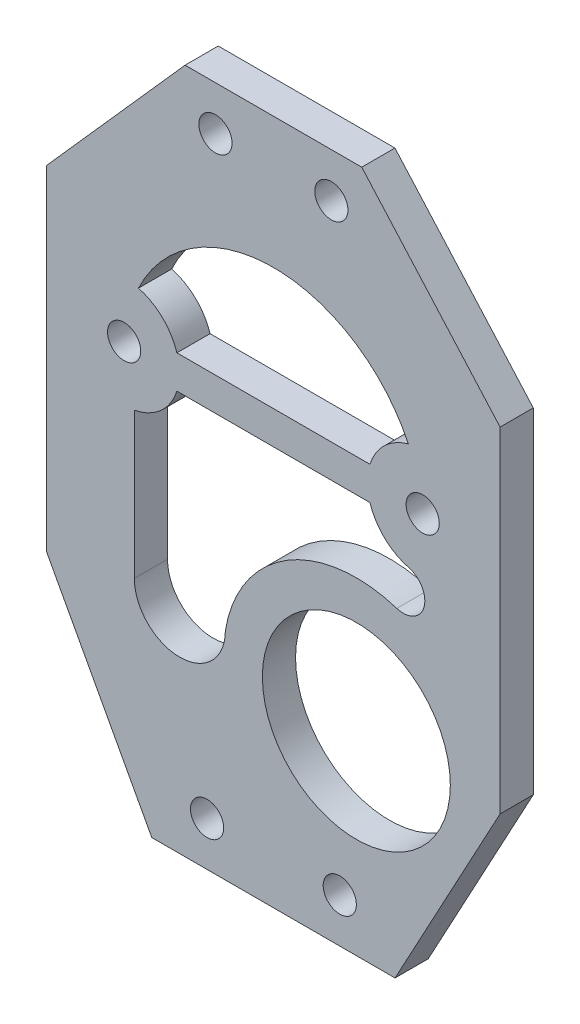
ISO-10303-21;
HEADER;
FILE_DESCRIPTION(('STEP AP214'),'2;1');
FILE_NAME('part.step','',(''),(''),'','','');
FILE_SCHEMA(('AUTOMOTIVE_DESIGN { 1 0 10303 214 1 1 1 1 }'));
ENDSEC;
DATA;
#1=APPLICATION_CONTEXT('core data for automotive mechanical design processes');
#2=APPLICATION_PROTOCOL_DEFINITION('international standard','automotive_design',2000,#1);
#3=PRODUCT_CONTEXT('',#1,'mechanical');
#4=PRODUCT('Part','Part','',(#3));
#5=PRODUCT_RELATED_PRODUCT_CATEGORY('part','',(#4));
#6=PRODUCT_DEFINITION_FORMATION('','',#4);
#7=PRODUCT_DEFINITION_CONTEXT('part definition',#1,'design');
#8=PRODUCT_DEFINITION('design','',#6,#7);
#9=PRODUCT_DEFINITION_SHAPE('','',#8);
#10=(LENGTH_UNIT() NAMED_UNIT(*) SI_UNIT(.MILLI.,.METRE.));
#11=(NAMED_UNIT(*) PLANE_ANGLE_UNIT() SI_UNIT($,.RADIAN.));
#12=(NAMED_UNIT(*) SI_UNIT($,.STERADIAN.) SOLID_ANGLE_UNIT());
#13=UNCERTAINTY_MEASURE_WITH_UNIT(LENGTH_MEASURE(1.E-05),#10,'distance_accuracy_value','');
#14=(GEOMETRIC_REPRESENTATION_CONTEXT(3) GLOBAL_UNCERTAINTY_ASSIGNED_CONTEXT((#13)) GLOBAL_UNIT_ASSIGNED_CONTEXT((#10,
#11,#12)) REPRESENTATION_CONTEXT('',''));
#15=CARTESIAN_POINT('',(0.,0.,0.));
#16=DIRECTION('',(0.,0.,1.));
#17=DIRECTION('',(1.,0.,0.));
#18=AXIS2_PLACEMENT_3D('',#15,#16,#17);
#19=CARTESIAN_POINT('',(11.7491477566959,30.8805656627284,3.));
#20=DIRECTION('',(0.,0.,-1.));
#21=DIRECTION('',(-1.,0.,0.));
#22=AXIS2_PLACEMENT_3D('',#19,#20,#21);
#23=CYLINDRICAL_SURFACE('',#22,1.94403911705029);
#24=CARTESIAN_POINT('',(11.7491477566959,30.8805656627284,0.));
#25=DIRECTION('',(0.,0.,1.));
#26=DIRECTION('',(1.,0.,0.));
#27=AXIS2_PLACEMENT_3D('',#24,#25,#26);
#28=CIRCLE('',#27,1.94403911705029);
#29=CARTESIAN_POINT('',(11.1567434050011,29.0289865602554,0.));
#30=VERTEX_POINT('',#29);
#31=CARTESIAN_POINT('',(12.2023496651043,32.7710407667265,0.));
#32=VERTEX_POINT('',#31);
#33=EDGE_CURVE('E264',#30,#32,#28,.T.);
#34=ORIENTED_EDGE('',*,*,#33,.F.);
#35=DIRECTION('',(0.,0.,-1.));
#36=VECTOR('',#35,1.);
#37=CARTESIAN_POINT('',(11.1567434050011,29.0289865602554,3.));
#38=LINE('',#37,#36);
#39=CARTESIAN_POINT('',(11.1567434050011,29.0289865602554,3.));
#40=VERTEX_POINT('',#39);
#41=EDGE_CURVE('E11',#40,#30,#38,.T.);
#42=ORIENTED_EDGE('',*,*,#41,.F.);
#43=CARTESIAN_POINT('',(11.7491477566959,30.8805656627284,3.));
#44=DIRECTION('',(0.,0.,1.));
#45=DIRECTION('',(1.,0.,0.));
#46=AXIS2_PLACEMENT_3D('',#43,#44,#45);
#47=CIRCLE('',#46,1.94403911705029);
#48=CARTESIAN_POINT('',(12.2023496651043,32.7710407667265,3.));
#49=VERTEX_POINT('',#48);
#50=EDGE_CURVE('E376',#40,#49,#47,.T.);
#51=ORIENTED_EDGE('',*,*,#50,.T.);
#52=DIRECTION('',(0.,0.,-1.));
#53=VECTOR('',#52,1.);
#54=CARTESIAN_POINT('',(12.2023496651043,32.7710407667265,3.));
#55=LINE('',#54,#53);
#56=EDGE_CURVE('E125',#49,#32,#55,.T.);
#57=ORIENTED_EDGE('',*,*,#56,.T.);
#58=EDGE_LOOP('',(#34,#42,#51,#57));
#59=FACE_BOUND('',#58,.T.);
#60=ADVANCED_FACE('F39',(#59),#23,.F.);
#61=CARTESIAN_POINT('',(7.50000000000001,17.599715906798,3.));
#62=DIRECTION('',(0.,0.,-1.));
#63=DIRECTION('',(-1.,0.,0.));
#64=AXIS2_PLACEMENT_3D('',#61,#62,#63);
#65=CYLINDRICAL_SURFACE('',#64,12.);
#66=CARTESIAN_POINT('',(7.50000000000001,17.599715906798,0.));
#67=DIRECTION('',(0.,0.,1.));
#68=DIRECTION('',(1.,0.,0.));
#69=AXIS2_PLACEMENT_3D('',#66,#67,#68);
#70=CIRCLE('',#69,12.);
#71=CARTESIAN_POINT('',(-4.34776022034606,19.5051234120801,0.));
#72=VERTEX_POINT('',#71);
#73=EDGE_CURVE('E267',#30,#72,#70,.T.);
#74=ORIENTED_EDGE('',*,*,#73,.T.);
#75=DIRECTION('',(0.,0.,-1.));
#76=VECTOR('',#75,1.);
#77=CARTESIAN_POINT('',(-4.34776022034606,19.5051234120801,3.));
#78=LINE('',#77,#76);
#79=CARTESIAN_POINT('',(-4.34776022034606,19.5051234120801,3.));
#80=VERTEX_POINT('',#79);
#81=EDGE_CURVE('E49',#80,#72,#78,.T.);
#82=ORIENTED_EDGE('',*,*,#81,.F.);
#83=CARTESIAN_POINT('',(7.50000000000001,17.599715906798,3.));
#84=DIRECTION('',(0.,0.,1.));
#85=DIRECTION('',(1.,0.,0.));
#86=AXIS2_PLACEMENT_3D('',#83,#84,#85);
#87=CIRCLE('',#86,12.);
#88=EDGE_CURVE('E378',#40,#80,#87,.T.);
#89=ORIENTED_EDGE('',*,*,#88,.F.);
#90=ORIENTED_EDGE('',*,*,#41,.T.);
#91=EDGE_LOOP('',(#74,#82,#89,#90));
#92=FACE_BOUND('',#91,.T.);
#93=ADVANCED_FACE('F392',(#92),#65,.T.);
#94=CARTESIAN_POINT('',(-8.46321629107642,19.5051234120801,3.));
#95=DIRECTION('',(0.,0.,-1.));
#96=DIRECTION('',(-1.,0.,0.));
#97=AXIS2_PLACEMENT_3D('',#94,#95,#96);
#98=CYLINDRICAL_SURFACE('',#97,4.11545607073036);
#99=CARTESIAN_POINT('',(-8.46321629107642,19.5051234120801,0.));
#100=DIRECTION('',(0.,0.,1.));
#101=DIRECTION('',(1.,0.,0.));
#102=AXIS2_PLACEMENT_3D('',#99,#100,#101);
#103=CIRCLE('',#102,4.11545607073036);
#104=CARTESIAN_POINT('',(-12.5786723618068,19.5051234120801,0.));
#105=VERTEX_POINT('',#104);
#106=EDGE_CURVE('E270',#105,#72,#103,.T.);
#107=ORIENTED_EDGE('',*,*,#106,.F.);
#108=DIRECTION('',(0.,0.,-1.));
#109=VECTOR('',#108,1.);
#110=CARTESIAN_POINT('',(-12.5786723618068,19.5051234120801,3.));
#111=LINE('',#110,#109);
#112=CARTESIAN_POINT('',(-12.5786723618068,19.5051234120801,3.));
#113=VERTEX_POINT('',#112);
#114=EDGE_CURVE('E285',#113,#105,#111,.T.);
#115=ORIENTED_EDGE('',*,*,#114,.F.);
#116=CARTESIAN_POINT('',(-8.46321629107642,19.5051234120801,3.));
#117=DIRECTION('',(0.,0.,1.));
#118=DIRECTION('',(1.,0.,0.));
#119=AXIS2_PLACEMENT_3D('',#116,#117,#118);
#120=CIRCLE('',#119,4.11545607073036);
#121=EDGE_CURVE('E380',#113,#80,#120,.T.);
#122=ORIENTED_EDGE('',*,*,#121,.T.);
#123=ORIENTED_EDGE('',*,*,#81,.T.);
#124=EDGE_LOOP('',(#107,#115,#122,#123));
#125=FACE_BOUND('',#124,.T.);
#126=ADVANCED_FACE('F394',(#125),#98,.F.);
#127=CARTESIAN_POINT('',(-12.5786723618068,0.,3.));
#128=DIRECTION('',(1.,0.,0.));
#129=DIRECTION('',(0.,0.,-1.));
#130=AXIS2_PLACEMENT_3D('',#127,#128,#129);
#131=PLANE('',#130);
#132=DIRECTION('',(0.,-1.,0.));
#133=VECTOR('',#132,1.);
#134=CARTESIAN_POINT('',(-12.5786723618068,0.,0.));
#135=LINE('',#134,#133);
#136=CARTESIAN_POINT('',(-12.5786723618068,32.6853334040719,0.));
#137=VERTEX_POINT('',#136);
#138=EDGE_CURVE('E273',#137,#105,#135,.T.);
#139=ORIENTED_EDGE('',*,*,#138,.F.);
#140=DIRECTION('',(0.,0.,-1.));
#141=VECTOR('',#140,1.);
#142=CARTESIAN_POINT('',(-12.5786723618068,32.6853334040719,3.));
#143=LINE('',#142,#141);
#144=CARTESIAN_POINT('',(-12.5786723618068,32.6853334040719,3.));
#145=VERTEX_POINT('',#144);
#146=EDGE_CURVE('E193',#145,#137,#143,.T.);
#147=ORIENTED_EDGE('',*,*,#146,.F.);
#148=DIRECTION('',(0.,-1.,0.));
#149=VECTOR('',#148,1.);
#150=CARTESIAN_POINT('',(-12.5786723618068,0.,3.));
#151=LINE('',#150,#149);
#152=EDGE_CURVE('E200',#145,#113,#151,.T.);
#153=ORIENTED_EDGE('',*,*,#152,.T.);
#154=ORIENTED_EDGE('',*,*,#114,.T.);
#155=EDGE_LOOP('',(#139,#147,#153,#154));
#156=FACE_BOUND('',#155,.T.);
#157=ADVANCED_FACE('F384',(#156),#131,.T.);
#158=CARTESIAN_POINT('',(-13.5,37.599715906798,3.));
#159=DIRECTION('',(0.,0.,-1.));
#160=DIRECTION('',(-1.,0.,0.));
#161=AXIS2_PLACEMENT_3D('',#158,#159,#160);
#162=CYLINDRICAL_SURFACE('',#161,5.);
#163=CARTESIAN_POINT('',(-13.5,37.599715906798,0.));
#164=DIRECTION('',(0.,0.,1.));
#165=DIRECTION('',(1.,0.,0.));
#166=AXIS2_PLACEMENT_3D('',#163,#164,#165);
#167=CIRCLE('',#166,5.);
#168=CARTESIAN_POINT('',(-8.73030399291528,36.0997159067981,0.));
#169=VERTEX_POINT('',#168);
#170=EDGE_CURVE('E188',#169,#137,#167,.F.);
#171=ORIENTED_EDGE('',*,*,#170,.F.);
#172=DIRECTION('',(0.,0.,-1.));
#173=VECTOR('',#172,1.);
#174=CARTESIAN_POINT('',(-8.73030399291528,36.0997159067981,3.));
#175=LINE('',#174,#173);
#176=CARTESIAN_POINT('',(-8.73030399291528,36.0997159067981,3.));
#177=VERTEX_POINT('',#176);
#178=EDGE_CURVE('E183',#177,#169,#175,.T.);
#179=ORIENTED_EDGE('',*,*,#178,.F.);
#180=CARTESIAN_POINT('',(-13.5,37.599715906798,3.));
#181=DIRECTION('',(0.,0.,1.));
#182=DIRECTION('',(1.,0.,0.));
#183=AXIS2_PLACEMENT_3D('',#180,#181,#182);
#184=CIRCLE('',#183,5.);
#185=EDGE_CURVE('E186',#177,#145,#184,.F.);
#186=ORIENTED_EDGE('',*,*,#185,.T.);
#187=ORIENTED_EDGE('',*,*,#146,.T.);
#188=EDGE_LOOP('',(#171,#179,#186,#187));
#189=FACE_BOUND('',#188,.T.);
#190=ADVANCED_FACE('F185',(#189),#162,.T.);
#191=CARTESIAN_POINT('',(0.,36.099715906798,3.));
#192=DIRECTION('',(0.,-1.,0.));
#193=DIRECTION('',(1.,0.,0.));
#194=AXIS2_PLACEMENT_3D('',#191,#192,#193);
#195=PLANE('',#194);
#196=DIRECTION('',(-1.,0.,0.));
#197=VECTOR('',#196,1.);
#198=CARTESIAN_POINT('',(0.,36.099715906798,0.));
#199=LINE('',#198,#197);
#200=CARTESIAN_POINT('',(8.73030399291528,36.099715906798,0.));
#201=VERTEX_POINT('',#200);
#202=EDGE_CURVE('E277',#201,#169,#199,.T.);
#203=ORIENTED_EDGE('',*,*,#202,.F.);
#204=DIRECTION('',(0.,0.,-1.));
#205=VECTOR('',#204,1.);
#206=CARTESIAN_POINT('',(8.73030399291528,36.099715906798,3.));
#207=LINE('',#206,#205);
#208=CARTESIAN_POINT('',(8.73030399291528,36.099715906798,3.));
#209=VERTEX_POINT('',#208);
#210=EDGE_CURVE('E118',#209,#201,#207,.T.);
#211=ORIENTED_EDGE('',*,*,#210,.F.);
#212=DIRECTION('',(-1.,0.,0.));
#213=VECTOR('',#212,1.);
#214=CARTESIAN_POINT('',(0.,36.099715906798,3.));
#215=LINE('',#214,#213);
#216=EDGE_CURVE('E197',#209,#177,#215,.T.);
#217=ORIENTED_EDGE('',*,*,#216,.T.);
#218=ORIENTED_EDGE('',*,*,#178,.T.);
#219=EDGE_LOOP('',(#203,#211,#217,#218));
#220=FACE_BOUND('',#219,.T.);
#221=ADVANCED_FACE('F202',(#220),#195,.T.);
#222=CARTESIAN_POINT('',(20.5,0.,3.));
#223=DIRECTION('',(-1.,0.,0.));
#224=DIRECTION('',(0.,0.,1.));
#225=AXIS2_PLACEMENT_3D('',#222,#223,#224);
#226=PLANE('',#225);
#227=DIRECTION('',(0.,1.,0.));
#228=VECTOR('',#227,1.);
#229=CARTESIAN_POINT('',(20.5,0.,0.));
#230=LINE('',#229,#228);
#231=CARTESIAN_POINT('',(20.5,17.599715906798,0.));
#232=VERTEX_POINT('',#231);
#233=CARTESIAN_POINT('',(20.5,47.899715906798,0.));
#234=VERTEX_POINT('',#233);
#235=EDGE_CURVE('E226',#232,#234,#230,.T.);
#236=ORIENTED_EDGE('',*,*,#235,.T.);
#237=DIRECTION('',(0.,0.,-1.));
#238=VECTOR('',#237,1.);
#239=CARTESIAN_POINT('',(20.5,47.899715906798,3.));
#240=LINE('',#239,#238);
#241=CARTESIAN_POINT('',(20.5,47.899715906798,3.));
#242=VERTEX_POINT('',#241);
#243=EDGE_CURVE('E282',#242,#234,#240,.T.);
#244=ORIENTED_EDGE('',*,*,#243,.F.);
#245=DIRECTION('',(0.,1.,0.));
#246=VECTOR('',#245,1.);
#247=CARTESIAN_POINT('',(20.5,0.,3.));
#248=LINE('',#247,#246);
#249=CARTESIAN_POINT('',(20.5,17.599715906798,3.));
#250=VERTEX_POINT('',#249);
#251=EDGE_CURVE('E339',#250,#242,#248,.T.);
#252=ORIENTED_EDGE('',*,*,#251,.F.);
#253=DIRECTION('',(0.,0.,-1.));
#254=VECTOR('',#253,1.);
#255=CARTESIAN_POINT('',(20.5,17.599715906798,3.));
#256=LINE('',#255,#254);
#257=EDGE_CURVE('E288',#250,#232,#256,.T.);
#258=ORIENTED_EDGE('',*,*,#257,.T.);
#259=EDGE_LOOP('',(#236,#244,#252,#258));
#260=FACE_BOUND('',#259,.T.);
#261=ADVANCED_FACE('F456',(#260),#226,.F.);
#262=CARTESIAN_POINT('',(35.2500523443548,31.2748547975971,3.));
#263=DIRECTION('',(-0.748025681336974,-0.663669782392083,0.));
#264=DIRECTION('',(0.663669782392083,-0.748025681336975,0.));
#265=AXIS2_PLACEMENT_3D('',#262,#263,#264);
#266=PLANE('',#265);
#267=DIRECTION('',(-0.663669782392083,0.748025681336975,0.));
#268=VECTOR('',#267,1.);
#269=CARTESIAN_POINT('',(35.2500523443548,31.2748547975971,0.));
#270=LINE('',#269,#268);
#271=CARTESIAN_POINT('',(7.98982460190923,62.,0.));
#272=VERTEX_POINT('',#271);
#273=EDGE_CURVE('E229',#234,#272,#270,.T.);
#274=ORIENTED_EDGE('',*,*,#273,.T.);
#275=DIRECTION('',(0.,0.,-1.));
#276=VECTOR('',#275,1.);
#277=CARTESIAN_POINT('',(7.98982460190923,62.,3.));
#278=LINE('',#277,#276);
#279=CARTESIAN_POINT('',(7.98982460190923,62.,3.));
#280=VERTEX_POINT('',#279);
#281=EDGE_CURVE('E301',#280,#272,#278,.T.);
#282=ORIENTED_EDGE('',*,*,#281,.F.);
#283=DIRECTION('',(-0.663669782392083,0.748025681336975,0.));
#284=VECTOR('',#283,1.);
#285=CARTESIAN_POINT('',(35.2500523443548,31.2748547975971,3.));
#286=LINE('',#285,#284);
#287=EDGE_CURVE('E342',#242,#280,#286,.T.);
#288=ORIENTED_EDGE('',*,*,#287,.F.);
#289=ORIENTED_EDGE('',*,*,#243,.T.);
#290=EDGE_LOOP('',(#274,#282,#288,#289));
#291=FACE_BOUND('',#290,.T.);
#292=ADVANCED_FACE('F452',(#291),#266,.F.);
#293=CARTESIAN_POINT('',(0.,62.,3.));
#294=DIRECTION('',(0.,1.,0.));
#295=DIRECTION('',(0.,0.,1.));
#296=AXIS2_PLACEMENT_3D('',#293,#294,#295);
#297=PLANE('',#296);
#298=DIRECTION('',(1.,0.,0.));
#299=VECTOR('',#298,1.);
#300=CARTESIAN_POINT('',(0.,62.,0.));
#301=LINE('',#300,#299);
#302=CARTESIAN_POINT('',(-7.98982460190924,62.,0.));
#303=VERTEX_POINT('',#302);
#304=EDGE_CURVE('E232',#303,#272,#301,.T.);
#305=ORIENTED_EDGE('',*,*,#304,.F.);
#306=DIRECTION('',(0.,0.,-1.));
#307=VECTOR('',#306,1.);
#308=CARTESIAN_POINT('',(-7.98982460190924,62.,3.));
#309=LINE('',#308,#307);
#310=CARTESIAN_POINT('',(-7.98982460190924,62.,3.));
#311=VERTEX_POINT('',#310);
#312=EDGE_CURVE('E299',#311,#303,#309,.T.);
#313=ORIENTED_EDGE('',*,*,#312,.F.);
#314=DIRECTION('',(1.,0.,0.));
#315=VECTOR('',#314,1.);
#316=CARTESIAN_POINT('',(0.,62.,3.));
#317=LINE('',#316,#315);
#318=EDGE_CURVE('E344',#311,#280,#317,.T.);
#319=ORIENTED_EDGE('',*,*,#318,.T.);
#320=ORIENTED_EDGE('',*,*,#281,.T.);
#321=EDGE_LOOP('',(#305,#313,#319,#320));
#322=FACE_BOUND('',#321,.T.);
#323=ADVANCED_FACE('F448',(#322),#297,.T.);
#324=CARTESIAN_POINT('',(-35.2500523443548,31.2748547975971,3.));
#325=DIRECTION('',(-0.748025681336974,0.663669782392083,0.));
#326=DIRECTION('',(-0.663669782392083,-0.748025681336975,0.));
#327=AXIS2_PLACEMENT_3D('',#324,#325,#326);
#328=PLANE('',#327);
#329=DIRECTION('',(0.663669782392083,0.748025681336975,0.));
#330=VECTOR('',#329,1.);
#331=CARTESIAN_POINT('',(-35.2500523443548,31.2748547975971,0.));
#332=LINE('',#331,#330);
#333=CARTESIAN_POINT('',(-20.5,47.899715906798,0.));
#334=VERTEX_POINT('',#333);
#335=EDGE_CURVE('E235',#334,#303,#332,.T.);
#336=ORIENTED_EDGE('',*,*,#335,.F.);
#337=DIRECTION('',(0.,0.,-1.));
#338=VECTOR('',#337,1.);
#339=CARTESIAN_POINT('',(-20.5,47.899715906798,3.));
#340=LINE('',#339,#338);
#341=CARTESIAN_POINT('',(-20.5,47.899715906798,3.));
#342=VERTEX_POINT('',#341);
#343=EDGE_CURVE('E297',#342,#334,#340,.T.);
#344=ORIENTED_EDGE('',*,*,#343,.F.);
#345=DIRECTION('',(0.663669782392083,0.748025681336975,0.));
#346=VECTOR('',#345,1.);
#347=CARTESIAN_POINT('',(-35.2500523443548,31.2748547975971,3.));
#348=LINE('',#347,#346);
#349=EDGE_CURVE('E347',#342,#311,#348,.T.);
#350=ORIENTED_EDGE('',*,*,#349,.T.);
#351=ORIENTED_EDGE('',*,*,#312,.T.);
#352=EDGE_LOOP('',(#336,#344,#350,#351));
#353=FACE_BOUND('',#352,.T.);
#354=ADVANCED_FACE('F444',(#353),#328,.T.);
#355=CARTESIAN_POINT('',(-20.5,0.,3.));
#356=DIRECTION('',(-1.,0.,0.));
#357=DIRECTION('',(0.,0.,1.));
#358=AXIS2_PLACEMENT_3D('',#355,#356,#357);
#359=PLANE('',#358);
#360=DIRECTION('',(0.,1.,0.));
#361=VECTOR('',#360,1.);
#362=CARTESIAN_POINT('',(-20.5,0.,0.));
#363=LINE('',#362,#361);
#364=CARTESIAN_POINT('',(-20.5,17.599715906798,0.));
#365=VERTEX_POINT('',#364);
#366=EDGE_CURVE('E238',#365,#334,#363,.T.);
#367=ORIENTED_EDGE('',*,*,#366,.F.);
#368=DIRECTION('',(0.,0.,-1.));
#369=VECTOR('',#368,1.);
#370=CARTESIAN_POINT('',(-20.5,17.599715906798,3.));
#371=LINE('',#370,#369);
#372=CARTESIAN_POINT('',(-20.5,17.599715906798,3.));
#373=VERTEX_POINT('',#372);
#374=EDGE_CURVE('E295',#373,#365,#371,.T.);
#375=ORIENTED_EDGE('',*,*,#374,.F.);
#376=DIRECTION('',(0.,1.,0.));
#377=VECTOR('',#376,1.);
#378=CARTESIAN_POINT('',(-20.5,0.,3.));
#379=LINE('',#378,#377);
#380=EDGE_CURVE('E350',#373,#342,#379,.T.);
#381=ORIENTED_EDGE('',*,*,#380,.T.);
#382=ORIENTED_EDGE('',*,*,#343,.T.);
#383=EDGE_LOOP('',(#367,#375,#381,#382));
#384=FACE_BOUND('',#383,.T.);
#385=ADVANCED_FACE('F440',(#384),#359,.T.);
#386=CARTESIAN_POINT('',(-8.518125,-4.59792578065099,3.));
#387=DIRECTION('',(-0.879985795339902,-0.475,0.));
#388=DIRECTION('',(0.475,-0.879985795339902,0.));
#389=AXIS2_PLACEMENT_3D('',#386,#387,#388);
#390=PLANE('',#389);
#391=DIRECTION('',(-0.475,0.879985795339902,0.));
#392=VECTOR('',#391,1.);
#393=CARTESIAN_POINT('',(-8.518125,-4.59792578065099,0.));
#394=LINE('',#393,#392);
#395=CARTESIAN_POINT('',(-11.,0.,0.));
#396=VERTEX_POINT('',#395);
#397=EDGE_CURVE('E241',#396,#365,#394,.T.);
#398=ORIENTED_EDGE('',*,*,#397,.F.);
#399=DIRECTION('',(0.,0.,-1.));
#400=VECTOR('',#399,1.);
#401=CARTESIAN_POINT('',(-11.,0.,3.));
#402=LINE('',#401,#400);
#403=CARTESIAN_POINT('',(-11.,0.,3.));
#404=VERTEX_POINT('',#403);
#405=EDGE_CURVE('E293',#404,#396,#402,.T.);
#406=ORIENTED_EDGE('',*,*,#405,.F.);
#407=DIRECTION('',(-0.475,0.879985795339902,0.));
#408=VECTOR('',#407,1.);
#409=CARTESIAN_POINT('',(-8.518125,-4.59792578065099,3.));
#410=LINE('',#409,#408);
#411=EDGE_CURVE('E353',#404,#373,#410,.T.);
#412=ORIENTED_EDGE('',*,*,#411,.T.);
#413=ORIENTED_EDGE('',*,*,#374,.T.);
#414=EDGE_LOOP('',(#398,#406,#412,#413));
#415=FACE_BOUND('',#414,.T.);
#416=ADVANCED_FACE('F436',(#415),#390,.T.);
#417=CARTESIAN_POINT('',(0.,0.,3.));
#418=DIRECTION('',(0.,-1.,0.));
#419=DIRECTION('',(0.,0.,-1.));
#420=AXIS2_PLACEMENT_3D('',#417,#418,#419);
#421=PLANE('',#420);
#422=DIRECTION('',(-1.,0.,0.));
#423=VECTOR('',#422,1.);
#424=CARTESIAN_POINT('',(0.,0.,0.));
#425=LINE('',#424,#423);
#426=CARTESIAN_POINT('',(11.,0.,0.));
#427=VERTEX_POINT('',#426);
#428=EDGE_CURVE('E244',#427,#396,#425,.T.);
#429=ORIENTED_EDGE('',*,*,#428,.F.);
#430=DIRECTION('',(0.,0.,-1.));
#431=VECTOR('',#430,1.);
#432=CARTESIAN_POINT('',(11.,0.,3.));
#433=LINE('',#432,#431);
#434=CARTESIAN_POINT('',(11.,0.,3.));
#435=VERTEX_POINT('',#434);
#436=EDGE_CURVE('E291',#435,#427,#433,.T.);
#437=ORIENTED_EDGE('',*,*,#436,.F.);
#438=DIRECTION('',(-1.,0.,0.));
#439=VECTOR('',#438,1.);
#440=CARTESIAN_POINT('',(0.,0.,3.));
#441=LINE('',#440,#439);
#442=EDGE_CURVE('E356',#435,#404,#441,.T.);
#443=ORIENTED_EDGE('',*,*,#442,.T.);
#444=ORIENTED_EDGE('',*,*,#405,.T.);
#445=EDGE_LOOP('',(#429,#437,#443,#444));
#446=FACE_BOUND('',#445,.T.);
#447=ADVANCED_FACE('F433',(#446),#421,.T.);
#448=CARTESIAN_POINT('',(0.,39.099715906798,3.));
#449=DIRECTION('',(0.,-1.,0.));
#450=DIRECTION('',(0.,0.,-1.));
#451=AXIS2_PLACEMENT_3D('',#448,#449,#450);
#452=PLANE('',#451);
#453=DIRECTION('',(-1.,0.,0.));
#454=VECTOR('',#453,1.);
#455=CARTESIAN_POINT('',(0.,39.099715906798,0.));
#456=LINE('',#455,#454);
#457=CARTESIAN_POINT('',(8.73030399291528,39.099715906798,0.));
#458=VERTEX_POINT('',#457);
#459=CARTESIAN_POINT('',(-8.73030399291528,39.099715906798,0.));
#460=VERTEX_POINT('',#459);
#461=EDGE_CURVE('E208',#458,#460,#456,.T.);
#462=ORIENTED_EDGE('',*,*,#461,.T.);
#463=DIRECTION('',(0.,0.,-1.));
#464=VECTOR('',#463,1.);
#465=CARTESIAN_POINT('',(-8.73030399291528,39.099715906798,3.));
#466=LINE('',#465,#464);
#467=CARTESIAN_POINT('',(-8.73030399291528,39.099715906798,3.));
#468=VERTEX_POINT('',#467);
#469=EDGE_CURVE('E43',#468,#460,#466,.T.);
#470=ORIENTED_EDGE('',*,*,#469,.F.);
#471=DIRECTION('',(-1.,0.,0.));
#472=VECTOR('',#471,1.);
#473=CARTESIAN_POINT('',(0.,39.099715906798,3.));
#474=LINE('',#473,#472);
#475=CARTESIAN_POINT('',(8.73030399291528,39.099715906798,3.));
#476=VERTEX_POINT('',#475);
#477=EDGE_CURVE('E133',#476,#468,#474,.T.);
#478=ORIENTED_EDGE('',*,*,#477,.F.);
#479=DIRECTION('',(0.,0.,-1.));
#480=VECTOR('',#479,1.);
#481=CARTESIAN_POINT('',(8.73030399291528,39.099715906798,3.));
#482=LINE('',#481,#480);
#483=EDGE_CURVE('E204',#476,#458,#482,.T.);
#484=ORIENTED_EDGE('',*,*,#483,.T.);
#485=EDGE_LOOP('',(#462,#470,#478,#484));
#486=FACE_BOUND('',#485,.T.);
#487=ADVANCED_FACE('F41',(#486),#452,.F.);
#488=CARTESIAN_POINT('',(-13.5,37.599715906798,3.));
#489=DIRECTION('',(0.,0.,-1.));
#490=DIRECTION('',(-1.,0.,0.));
#491=AXIS2_PLACEMENT_3D('',#488,#489,#490);
#492=CYLINDRICAL_SURFACE('',#491,5.00000000000001);
#493=CARTESIAN_POINT('',(-13.5,37.599715906798,0.));
#494=DIRECTION('',(0.,0.,1.));
#495=DIRECTION('',(1.,0.,0.));
#496=AXIS2_PLACEMENT_3D('',#493,#494,#495);
#497=CIRCLE('',#496,5.00000000000001);
#498=CARTESIAN_POINT('',(-12.2023496651044,42.4283910468696,0.));
#499=VERTEX_POINT('',#498);
#500=EDGE_CURVE('E211',#499,#460,#497,.F.);
#501=ORIENTED_EDGE('',*,*,#500,.F.);
#502=DIRECTION('',(0.,0.,-1.));
#503=VECTOR('',#502,1.);
#504=CARTESIAN_POINT('',(-12.2023496651044,42.4283910468696,3.));
#505=LINE('',#504,#503);
#506=CARTESIAN_POINT('',(-12.2023496651044,42.4283910468696,3.));
#507=VERTEX_POINT('',#506);
#508=EDGE_CURVE('E307',#507,#499,#505,.T.);
#509=ORIENTED_EDGE('',*,*,#508,.F.);
#510=CARTESIAN_POINT('',(-13.5,37.599715906798,3.));
#511=DIRECTION('',(0.,0.,1.));
#512=DIRECTION('',(1.,0.,0.));
#513=AXIS2_PLACEMENT_3D('',#510,#511,#512);
#514=CIRCLE('',#513,5.00000000000001);
#515=EDGE_CURVE('E315',#507,#468,#514,.F.);
#516=ORIENTED_EDGE('',*,*,#515,.T.);
#517=ORIENTED_EDGE('',*,*,#469,.T.);
#518=EDGE_LOOP('',(#501,#509,#516,#517));
#519=FACE_BOUND('',#518,.T.);
#520=ADVANCED_FACE('F314',(#519),#492,.T.);
#521=CARTESIAN_POINT('',(0.,36.6532146296051,3.));
#522=DIRECTION('',(0.,0.,-1.));
#523=DIRECTION('',(-1.,0.,0.));
#524=AXIS2_PLACEMENT_3D('',#521,#522,#523);
#525=CYLINDRICAL_SURFACE('',#524,13.5);
#526=CARTESIAN_POINT('',(0.,36.6532146296051,0.));
#527=DIRECTION('',(0.,0.,1.));
#528=DIRECTION('',(1.,0.,0.));
#529=AXIS2_PLACEMENT_3D('',#526,#527,#528);
#530=CIRCLE('',#529,13.5);
#531=CARTESIAN_POINT('',(12.2023496651043,42.4283910468696,0.));
#532=VERTEX_POINT('',#531);
#533=EDGE_CURVE('E214',#499,#532,#530,.F.);
#534=ORIENTED_EDGE('',*,*,#533,.T.);
#535=DIRECTION('',(0.,0.,-1.));
#536=VECTOR('',#535,1.);
#537=CARTESIAN_POINT('',(12.2023496651043,42.4283910468696,3.));
#538=LINE('',#537,#536);
#539=CARTESIAN_POINT('',(12.2023496651043,42.4283910468696,3.));
#540=VERTEX_POINT('',#539);
#541=EDGE_CURVE('E306',#540,#532,#538,.T.);
#542=ORIENTED_EDGE('',*,*,#541,.F.);
#543=CARTESIAN_POINT('',(0.,36.6532146296051,3.));
#544=DIRECTION('',(0.,0.,1.));
#545=DIRECTION('',(1.,0.,0.));
#546=AXIS2_PLACEMENT_3D('',#543,#544,#545);
#547=CIRCLE('',#546,13.5);
#548=EDGE_CURVE('E325',#507,#540,#547,.F.);
#549=ORIENTED_EDGE('',*,*,#548,.F.);
#550=ORIENTED_EDGE('',*,*,#508,.T.);
#551=EDGE_LOOP('',(#534,#542,#549,#550));
#552=FACE_BOUND('',#551,.T.);
#553=ADVANCED_FACE('F323',(#552),#525,.F.);
#554=CARTESIAN_POINT('',(5.23982460190923,58.,3.));
#555=DIRECTION('',(0.,0.,-1.));
#556=DIRECTION('',(-1.,0.,0.));
#557=AXIS2_PLACEMENT_3D('',#554,#555,#556);
#558=CYLINDRICAL_SURFACE('',#557,1.5);
#559=CARTESIAN_POINT('',(5.23982460190923,58.,3.));
#560=DIRECTION('',(0.,0.,1.));
#561=DIRECTION('',(1.,0.,0.));
#562=AXIS2_PLACEMENT_3D('',#559,#560,#561);
#563=CIRCLE('',#562,1.5);
#564=CARTESIAN_POINT('',(6.73982460190923,58.,3.));
#565=VERTEX_POINT('',#564);
#566=EDGE_CURVE('E373',#565,#565,#563,.F.);
#567=ORIENTED_EDGE('',*,*,#566,.F.);
#568=EDGE_LOOP('',(#567));
#569=FACE_BOUND('',#568,.T.);
#570=CARTESIAN_POINT('',(5.23982460190923,58.,0.));
#571=DIRECTION('',(0.,0.,1.));
#572=DIRECTION('',(1.,0.,0.));
#573=AXIS2_PLACEMENT_3D('',#570,#571,#572);
#574=CIRCLE('',#573,1.5);
#575=CARTESIAN_POINT('',(6.73982460190923,58.,0.));
#576=VERTEX_POINT('',#575);
#577=EDGE_CURVE('E261',#576,#576,#574,.F.);
#578=ORIENTED_EDGE('',*,*,#577,.T.);
#579=EDGE_LOOP('',(#578));
#580=FACE_BOUND('',#579,.T.);
#581=ADVANCED_FACE('F408',(#569,#580),#558,.F.);
#582=CARTESIAN_POINT('',(6.,4.,3.));
#583=DIRECTION('',(0.,0.,-1.));
#584=DIRECTION('',(-1.,0.,0.));
#585=AXIS2_PLACEMENT_3D('',#582,#583,#584);
#586=CYLINDRICAL_SURFACE('',#585,1.5);
#587=CARTESIAN_POINT('',(6.,4.,3.));
#588=DIRECTION('',(0.,0.,1.));
#589=DIRECTION('',(1.,0.,0.));
#590=AXIS2_PLACEMENT_3D('',#587,#588,#589);
#591=CIRCLE('',#590,1.5);
#592=CARTESIAN_POINT('',(7.5,4.,3.));
#593=VERTEX_POINT('',#592);
#594=EDGE_CURVE('E370',#593,#593,#591,.F.);
#595=ORIENTED_EDGE('',*,*,#594,.F.);
#596=EDGE_LOOP('',(#595));
#597=FACE_BOUND('',#596,.T.);
#598=CARTESIAN_POINT('',(6.,4.,0.));
#599=DIRECTION('',(0.,0.,1.));
#600=DIRECTION('',(1.,0.,0.));
#601=AXIS2_PLACEMENT_3D('',#598,#599,#600);
#602=CIRCLE('',#601,1.5);
#603=CARTESIAN_POINT('',(7.5,4.,0.));
#604=VERTEX_POINT('',#603);
#605=EDGE_CURVE('E258',#604,#604,#602,.F.);
#606=ORIENTED_EDGE('',*,*,#605,.T.);
#607=EDGE_LOOP('',(#606));
#608=FACE_BOUND('',#607,.T.);
#609=ADVANCED_FACE('F411',(#597,#608),#586,.F.);
#610=CARTESIAN_POINT('',(-13.5,37.599715906798,3.));
#611=DIRECTION('',(0.,0.,-1.));
#612=DIRECTION('',(-1.,0.,0.));
#613=AXIS2_PLACEMENT_3D('',#610,#611,#612);
#614=CYLINDRICAL_SURFACE('',#613,1.5);
#615=CARTESIAN_POINT('',(-13.5,37.599715906798,3.));
#616=DIRECTION('',(0.,0.,1.));
#617=DIRECTION('',(1.,0.,0.));
#618=AXIS2_PLACEMENT_3D('',#615,#616,#617);
#619=CIRCLE('',#618,1.5);
#620=CARTESIAN_POINT('',(-12.,37.599715906798,3.));
#621=VERTEX_POINT('',#620);
#622=EDGE_CURVE('E367',#621,#621,#619,.T.);
#623=ORIENTED_EDGE('',*,*,#622,.T.);
#624=EDGE_LOOP('',(#623));
#625=FACE_BOUND('',#624,.T.);
#626=CARTESIAN_POINT('',(-13.5,37.599715906798,0.));
#627=DIRECTION('',(0.,0.,1.));
#628=DIRECTION('',(1.,0.,0.));
#629=AXIS2_PLACEMENT_3D('',#626,#627,#628);
#630=CIRCLE('',#629,1.5);
#631=CARTESIAN_POINT('',(-12.,37.599715906798,0.));
#632=VERTEX_POINT('',#631);
#633=EDGE_CURVE('E255',#632,#632,#630,.T.);
#634=ORIENTED_EDGE('',*,*,#633,.F.);
#635=EDGE_LOOP('',(#634));
#636=FACE_BOUND('',#635,.T.);
#637=ADVANCED_FACE('F415',(#625,#636),#614,.F.);
#638=CARTESIAN_POINT('',(-6.,4.,3.));
#639=DIRECTION('',(0.,0.,-1.));
#640=DIRECTION('',(-1.,0.,0.));
#641=AXIS2_PLACEMENT_3D('',#638,#639,#640);
#642=CYLINDRICAL_SURFACE('',#641,1.5);
#643=CARTESIAN_POINT('',(-6.,4.,3.));
#644=DIRECTION('',(0.,0.,1.));
#645=DIRECTION('',(1.,0.,0.));
#646=AXIS2_PLACEMENT_3D('',#643,#644,#645);
#647=CIRCLE('',#646,1.5);
#648=CARTESIAN_POINT('',(-4.5,4.,3.));
#649=VERTEX_POINT('',#648);
#650=EDGE_CURVE('E364',#649,#649,#647,.T.);
#651=ORIENTED_EDGE('',*,*,#650,.T.);
#652=EDGE_LOOP('',(#651));
#653=FACE_BOUND('',#652,.T.);
#654=CARTESIAN_POINT('',(-6.,4.,0.));
#655=DIRECTION('',(0.,0.,1.));
#656=DIRECTION('',(1.,0.,0.));
#657=AXIS2_PLACEMENT_3D('',#654,#655,#656);
#658=CIRCLE('',#657,1.5);
#659=CARTESIAN_POINT('',(-4.5,4.,0.));
#660=VERTEX_POINT('',#659);
#661=EDGE_CURVE('E252',#660,#660,#658,.T.);
#662=ORIENTED_EDGE('',*,*,#661,.F.);
#663=EDGE_LOOP('',(#662));
#664=FACE_BOUND('',#663,.T.);
#665=ADVANCED_FACE('F419',(#653,#664),#642,.F.);
#666=CARTESIAN_POINT('',(-5.23982460190923,58.,3.));
#667=DIRECTION('',(0.,0.,-1.));
#668=DIRECTION('',(-1.,0.,0.));
#669=AXIS2_PLACEMENT_3D('',#666,#667,#668);
#670=CYLINDRICAL_SURFACE('',#669,1.5);
#671=CARTESIAN_POINT('',(-5.23982460190923,58.,3.));
#672=DIRECTION('',(0.,0.,1.));
#673=DIRECTION('',(1.,0.,0.));
#674=AXIS2_PLACEMENT_3D('',#671,#672,#673);
#675=CIRCLE('',#674,1.5);
#676=CARTESIAN_POINT('',(-3.73982460190923,58.,3.));
#677=VERTEX_POINT('',#676);
#678=EDGE_CURVE('E361',#677,#677,#675,.T.);
#679=ORIENTED_EDGE('',*,*,#678,.T.);
#680=EDGE_LOOP('',(#679));
#681=FACE_BOUND('',#680,.T.);
#682=CARTESIAN_POINT('',(-5.23982460190923,58.,0.));
#683=DIRECTION('',(0.,0.,1.));
#684=DIRECTION('',(1.,0.,0.));
#685=AXIS2_PLACEMENT_3D('',#682,#683,#684);
#686=CIRCLE('',#685,1.5);
#687=CARTESIAN_POINT('',(-3.73982460190923,58.,0.));
#688=VERTEX_POINT('',#687);
#689=EDGE_CURVE('E249',#688,#688,#686,.T.);
#690=ORIENTED_EDGE('',*,*,#689,.F.);
#691=EDGE_LOOP('',(#690));
#692=FACE_BOUND('',#691,.T.);
#693=ADVANCED_FACE('F423',(#681,#692),#670,.F.);
#694=CARTESIAN_POINT('',(8.518125,-4.59792578065099,3.));
#695=DIRECTION('',(-0.879985795339902,0.475,0.));
#696=DIRECTION('',(-0.475,-0.879985795339902,0.));
#697=AXIS2_PLACEMENT_3D('',#694,#695,#696);
#698=PLANE('',#697);
#699=DIRECTION('',(0.475,0.879985795339902,0.));
#700=VECTOR('',#699,1.);
#701=CARTESIAN_POINT('',(8.518125,-4.59792578065099,0.));
#702=LINE('',#701,#700);
#703=EDGE_CURVE('E247',#427,#232,#702,.T.);
#704=ORIENTED_EDGE('',*,*,#703,.T.);
#705=ORIENTED_EDGE('',*,*,#257,.F.);
#706=DIRECTION('',(0.475,0.879985795339902,0.));
#707=VECTOR('',#706,1.);
#708=CARTESIAN_POINT('',(8.518125,-4.59792578065099,3.));
#709=LINE('',#708,#707);
#710=EDGE_CURVE('E359',#435,#250,#709,.T.);
#711=ORIENTED_EDGE('',*,*,#710,.F.);
#712=ORIENTED_EDGE('',*,*,#436,.T.);
#713=EDGE_LOOP('',(#704,#705,#711,#712));
#714=FACE_BOUND('',#713,.T.);
#715=ADVANCED_FACE('F427',(#714),#698,.F.);
#716=CARTESIAN_POINT('',(13.5,37.599715906798,3.));
#717=DIRECTION('',(0.,0.,-1.));
#718=DIRECTION('',(-1.,0.,0.));
#719=AXIS2_PLACEMENT_3D('',#716,#717,#718);
#720=CYLINDRICAL_SURFACE('',#719,1.5);
#721=CARTESIAN_POINT('',(13.5,37.599715906798,3.));
#722=DIRECTION('',(0.,0.,1.));
#723=DIRECTION('',(1.,0.,0.));
#724=AXIS2_PLACEMENT_3D('',#721,#722,#723);
#725=CIRCLE('',#724,1.5);
#726=CARTESIAN_POINT('',(15.,37.599715906798,3.));
#727=VERTEX_POINT('',#726);
#728=EDGE_CURVE('E332',#727,#727,#725,.F.);
#729=ORIENTED_EDGE('',*,*,#728,.F.);
#730=EDGE_LOOP('',(#729));
#731=FACE_BOUND('',#730,.T.);
#732=CARTESIAN_POINT('',(13.5,37.599715906798,0.));
#733=DIRECTION('',(0.,0.,1.));
#734=DIRECTION('',(1.,0.,0.));
#735=AXIS2_PLACEMENT_3D('',#732,#733,#734);
#736=CIRCLE('',#735,1.5);
#737=CARTESIAN_POINT('',(15.,37.599715906798,0.));
#738=VERTEX_POINT('',#737);
#739=EDGE_CURVE('E223',#738,#738,#736,.F.);
#740=ORIENTED_EDGE('',*,*,#739,.T.);
#741=EDGE_LOOP('',(#740));
#742=FACE_BOUND('',#741,.T.);
#743=ADVANCED_FACE('F431',(#731,#742),#720,.F.);
#744=CARTESIAN_POINT('',(7.5,17.599715906798,3.));
#745=DIRECTION('',(0.,0.,-1.));
#746=DIRECTION('',(-1.,0.,0.));
#747=AXIS2_PLACEMENT_3D('',#744,#745,#746);
#748=CYLINDRICAL_SURFACE('',#747,8.5);
#749=CARTESIAN_POINT('',(7.5,17.599715906798,3.));
#750=DIRECTION('',(0.,0.,1.));
#751=DIRECTION('',(1.,0.,0.));
#752=AXIS2_PLACEMENT_3D('',#749,#750,#751);
#753=CIRCLE('',#752,8.5);
#754=CARTESIAN_POINT('',(16.,17.599715906798,3.));
#755=VERTEX_POINT('',#754);
#756=EDGE_CURVE('E329',#755,#755,#753,.T.);
#757=ORIENTED_EDGE('',*,*,#756,.T.);
#758=EDGE_LOOP('',(#757));
#759=FACE_BOUND('',#758,.T.);
#760=CARTESIAN_POINT('',(7.5,17.599715906798,0.));
#761=DIRECTION('',(0.,0.,1.));
#762=DIRECTION('',(1.,0.,0.));
#763=AXIS2_PLACEMENT_3D('',#760,#761,#762);
#764=CIRCLE('',#763,8.5);
#765=CARTESIAN_POINT('',(16.,17.599715906798,0.));
#766=VERTEX_POINT('',#765);
#767=EDGE_CURVE('E220',#766,#766,#764,.T.);
#768=ORIENTED_EDGE('',*,*,#767,.F.);
#769=EDGE_LOOP('',(#768));
#770=FACE_BOUND('',#769,.T.);
#771=ADVANCED_FACE('F463',(#759,#770),#748,.F.);
#772=CARTESIAN_POINT('',(13.5,37.5997159067981,3.));
#773=DIRECTION('',(0.,0.,-1.));
#774=DIRECTION('',(-1.,0.,0.));
#775=AXIS2_PLACEMENT_3D('',#772,#773,#774);
#776=CYLINDRICAL_SURFACE('',#775,4.99999999999999);
#777=CARTESIAN_POINT('',(13.5,37.5997159067981,0.));
#778=DIRECTION('',(0.,0.,1.));
#779=DIRECTION('',(1.,0.,0.));
#780=AXIS2_PLACEMENT_3D('',#777,#778,#779);
#781=CIRCLE('',#780,4.99999999999999);
#782=EDGE_CURVE('E217',#458,#532,#781,.F.);
#783=ORIENTED_EDGE('',*,*,#782,.F.);
#784=ORIENTED_EDGE('',*,*,#483,.F.);
#785=CARTESIAN_POINT('',(13.5,37.5997159067981,3.));
#786=DIRECTION('',(0.,0.,1.));
#787=DIRECTION('',(1.,0.,0.));
#788=AXIS2_PLACEMENT_3D('',#785,#786,#787);
#789=CIRCLE('',#788,4.99999999999999);
#790=EDGE_CURVE('E327',#476,#540,#789,.F.);
#791=ORIENTED_EDGE('',*,*,#790,.T.);
#792=ORIENTED_EDGE('',*,*,#541,.T.);
#793=EDGE_LOOP('',(#783,#784,#791,#792));
#794=FACE_BOUND('',#793,.T.);
#795=ADVANCED_FACE('F328',(#794),#776,.T.);
#796=CARTESIAN_POINT('',(13.5,37.599715906798,3.));
#797=DIRECTION('',(0.,0.,-1.));
#798=DIRECTION('',(-1.,0.,0.));
#799=AXIS2_PLACEMENT_3D('',#796,#797,#798);
#800=CYLINDRICAL_SURFACE('',#799,5.);
#801=CARTESIAN_POINT('',(13.5,37.599715906798,0.));
#802=DIRECTION('',(0.,0.,1.));
#803=DIRECTION('',(1.,0.,0.));
#804=AXIS2_PLACEMENT_3D('',#801,#802,#803);
#805=CIRCLE('',#804,5.);
#806=EDGE_CURVE('E279',#201,#32,#805,.T.);
#807=ORIENTED_EDGE('',*,*,#806,.T.);
#808=ORIENTED_EDGE('',*,*,#56,.F.);
#809=CARTESIAN_POINT('',(13.5,37.599715906798,3.));
#810=DIRECTION('',(0.,0.,1.));
#811=DIRECTION('',(1.,0.,0.));
#812=AXIS2_PLACEMENT_3D('',#809,#810,#811);
#813=CIRCLE('',#812,5.);
#814=EDGE_CURVE('E58',#209,#49,#813,.T.);
#815=ORIENTED_EDGE('',*,*,#814,.F.);
#816=ORIENTED_EDGE('',*,*,#210,.T.);
#817=EDGE_LOOP('',(#807,#808,#815,#816));
#818=FACE_BOUND('',#817,.T.);
#819=ADVANCED_FACE('F388',(#818),#800,.T.);
#820=CARTESIAN_POINT('',(0.,0.,3.));
#821=DIRECTION('',(0.,0.,1.));
#822=DIRECTION('',(1.,0.,0.));
#823=AXIS2_PLACEMENT_3D('',#820,#821,#822);
#824=PLANE('',#823);
#825=ORIENTED_EDGE('',*,*,#477,.T.);
#826=ORIENTED_EDGE('',*,*,#515,.F.);
#827=ORIENTED_EDGE('',*,*,#548,.T.);
#828=ORIENTED_EDGE('',*,*,#790,.F.);
#829=EDGE_LOOP('',(#825,#826,#827,#828));
#830=FACE_BOUND('',#829,.T.);
#831=ORIENTED_EDGE('',*,*,#756,.F.);
#832=EDGE_LOOP('',(#831));
#833=FACE_BOUND('',#832,.T.);
#834=ORIENTED_EDGE('',*,*,#728,.T.);
#835=EDGE_LOOP('',(#834));
#836=FACE_BOUND('',#835,.T.);
#837=ORIENTED_EDGE('',*,*,#251,.T.);
#838=ORIENTED_EDGE('',*,*,#287,.T.);
#839=ORIENTED_EDGE('',*,*,#318,.F.);
#840=ORIENTED_EDGE('',*,*,#349,.F.);
#841=ORIENTED_EDGE('',*,*,#380,.F.);
#842=ORIENTED_EDGE('',*,*,#411,.F.);
#843=ORIENTED_EDGE('',*,*,#442,.F.);
#844=ORIENTED_EDGE('',*,*,#710,.T.);
#845=EDGE_LOOP('',(#837,#838,#839,#840,#841,#842,#843,#844));
#846=FACE_BOUND('',#845,.T.);
#847=ORIENTED_EDGE('',*,*,#678,.F.);
#848=EDGE_LOOP('',(#847));
#849=FACE_BOUND('',#848,.T.);
#850=ORIENTED_EDGE('',*,*,#650,.F.);
#851=EDGE_LOOP('',(#850));
#852=FACE_BOUND('',#851,.T.);
#853=ORIENTED_EDGE('',*,*,#622,.F.);
#854=EDGE_LOOP('',(#853));
#855=FACE_BOUND('',#854,.T.);
#856=ORIENTED_EDGE('',*,*,#594,.T.);
#857=EDGE_LOOP('',(#856));
#858=FACE_BOUND('',#857,.T.);
#859=ORIENTED_EDGE('',*,*,#566,.T.);
#860=EDGE_LOOP('',(#859));
#861=FACE_BOUND('',#860,.T.);
#862=ORIENTED_EDGE('',*,*,#50,.F.);
#863=ORIENTED_EDGE('',*,*,#88,.T.);
#864=ORIENTED_EDGE('',*,*,#121,.F.);
#865=ORIENTED_EDGE('',*,*,#152,.F.);
#866=ORIENTED_EDGE('',*,*,#185,.F.);
#867=ORIENTED_EDGE('',*,*,#216,.F.);
#868=ORIENTED_EDGE('',*,*,#814,.T.);
#869=EDGE_LOOP('',(#862,#863,#864,#865,#866,#867,#868));
#870=FACE_BOUND('',#869,.T.);
#871=ADVANCED_FACE('F196',(#830,#833,#836,#846,#849,#852,#855,#858,#861,#870),#824,.T.);
#872=CARTESIAN_POINT('',(0.,0.,0.));
#873=DIRECTION('',(0.,0.,1.));
#874=DIRECTION('',(1.,0.,0.));
#875=AXIS2_PLACEMENT_3D('',#872,#873,#874);
#876=PLANE('',#875);
#877=ORIENTED_EDGE('',*,*,#461,.F.);
#878=ORIENTED_EDGE('',*,*,#782,.T.);
#879=ORIENTED_EDGE('',*,*,#533,.F.);
#880=ORIENTED_EDGE('',*,*,#500,.T.);
#881=EDGE_LOOP('',(#877,#878,#879,#880));
#882=FACE_BOUND('',#881,.T.);
#883=ORIENTED_EDGE('',*,*,#767,.T.);
#884=EDGE_LOOP('',(#883));
#885=FACE_BOUND('',#884,.T.);
#886=ORIENTED_EDGE('',*,*,#739,.F.);
#887=EDGE_LOOP('',(#886));
#888=FACE_BOUND('',#887,.T.);
#889=ORIENTED_EDGE('',*,*,#235,.F.);
#890=ORIENTED_EDGE('',*,*,#703,.F.);
#891=ORIENTED_EDGE('',*,*,#428,.T.);
#892=ORIENTED_EDGE('',*,*,#397,.T.);
#893=ORIENTED_EDGE('',*,*,#366,.T.);
#894=ORIENTED_EDGE('',*,*,#335,.T.);
#895=ORIENTED_EDGE('',*,*,#304,.T.);
#896=ORIENTED_EDGE('',*,*,#273,.F.);
#897=EDGE_LOOP('',(#889,#890,#891,#892,#893,#894,#895,#896));
#898=FACE_BOUND('',#897,.T.);
#899=ORIENTED_EDGE('',*,*,#689,.T.);
#900=EDGE_LOOP('',(#899));
#901=FACE_BOUND('',#900,.T.);
#902=ORIENTED_EDGE('',*,*,#661,.T.);
#903=EDGE_LOOP('',(#902));
#904=FACE_BOUND('',#903,.T.);
#905=ORIENTED_EDGE('',*,*,#633,.T.);
#906=EDGE_LOOP('',(#905));
#907=FACE_BOUND('',#906,.T.);
#908=ORIENTED_EDGE('',*,*,#605,.F.);
#909=EDGE_LOOP('',(#908));
#910=FACE_BOUND('',#909,.T.);
#911=ORIENTED_EDGE('',*,*,#577,.F.);
#912=EDGE_LOOP('',(#911));
#913=FACE_BOUND('',#912,.T.);
#914=ORIENTED_EDGE('',*,*,#33,.T.);
#915=ORIENTED_EDGE('',*,*,#806,.F.);
#916=ORIENTED_EDGE('',*,*,#202,.T.);
#917=ORIENTED_EDGE('',*,*,#170,.T.);
#918=ORIENTED_EDGE('',*,*,#138,.T.);
#919=ORIENTED_EDGE('',*,*,#106,.T.);
#920=ORIENTED_EDGE('',*,*,#73,.F.);
#921=EDGE_LOOP('',(#914,#915,#916,#917,#918,#919,#920));
#922=FACE_BOUND('',#921,.T.);
#923=ADVANCED_FACE('F320',(#882,#885,#888,#898,#901,#904,#907,#910,#913,#922),#876,.F.);
#924=CLOSED_SHELL('',(#60,#93,#126,#157,#190,#221,#261,#292,#323,#354,#385,#416,#447,#487,#520,
#553,#581,#609,#637,#665,#693,#715,#743,#771,#795,#819,#871,#923));
#925=MANIFOLD_SOLID_BREP('B2',#924);
#926=ADVANCED_BREP_SHAPE_REPRESENTATION('',(#18,#925),#14);
#927=SHAPE_DEFINITION_REPRESENTATION(#9,#926);
ENDSEC;
END-ISO-10303-21;
